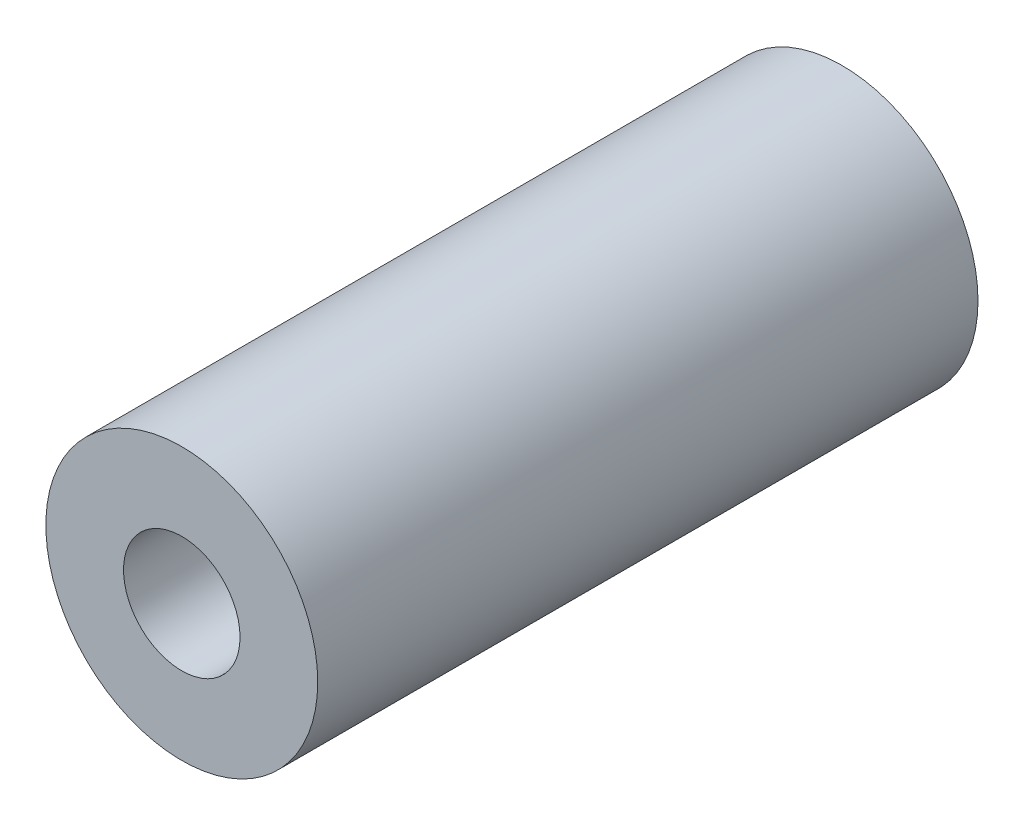
ISO-10303-21;
HEADER;
FILE_DESCRIPTION(('STEP AP214'),'2;1');
FILE_NAME('part.step','',(''),(''),'','','');
FILE_SCHEMA(('AUTOMOTIVE_DESIGN { 1 0 10303 214 1 1 1 1 }'));
ENDSEC;
DATA;
#1=APPLICATION_CONTEXT('core data for automotive mechanical design processes');
#2=APPLICATION_PROTOCOL_DEFINITION('international standard','automotive_design',2000,#1);
#3=PRODUCT_CONTEXT('',#1,'mechanical');
#4=PRODUCT('Part','Part','',(#3));
#5=PRODUCT_RELATED_PRODUCT_CATEGORY('part','',(#4));
#6=PRODUCT_DEFINITION_FORMATION('','',#4);
#7=PRODUCT_DEFINITION_CONTEXT('part definition',#1,'design');
#8=PRODUCT_DEFINITION('design','',#6,#7);
#9=PRODUCT_DEFINITION_SHAPE('','',#8);
#10=(LENGTH_UNIT() NAMED_UNIT(*) SI_UNIT(.MILLI.,.METRE.));
#11=(NAMED_UNIT(*) PLANE_ANGLE_UNIT() SI_UNIT($,.RADIAN.));
#12=(NAMED_UNIT(*) SI_UNIT($,.STERADIAN.) SOLID_ANGLE_UNIT());
#13=UNCERTAINTY_MEASURE_WITH_UNIT(LENGTH_MEASURE(1.E-05),#10,'distance_accuracy_value','');
#14=(GEOMETRIC_REPRESENTATION_CONTEXT(3) GLOBAL_UNCERTAINTY_ASSIGNED_CONTEXT((#13)) GLOBAL_UNIT_ASSIGNED_CONTEXT((#10,
#11,#12)) REPRESENTATION_CONTEXT('',''));
#15=CARTESIAN_POINT('',(0.,0.,0.));
#16=DIRECTION('',(0.,0.,1.));
#17=DIRECTION('',(1.,0.,0.));
#18=AXIS2_PLACEMENT_3D('',#15,#16,#17);
#19=CARTESIAN_POINT('',(0.,0.,17.));
#20=DIRECTION('',(0.,0.,1.));
#21=DIRECTION('',(1.,0.,0.));
#22=AXIS2_PLACEMENT_3D('',#19,#20,#21);
#23=PLANE('',#22);
#24=CARTESIAN_POINT('',(0.,0.,17.));
#25=DIRECTION('',(0.,0.,1.));
#26=DIRECTION('',(1.,0.,0.));
#27=AXIS2_PLACEMENT_3D('',#24,#25,#26);
#28=CIRCLE('',#27,3.5);
#29=CARTESIAN_POINT('',(3.5,0.,17.));
#30=VERTEX_POINT('',#29);
#31=EDGE_CURVE('E10',#30,#30,#28,.T.);
#32=ORIENTED_EDGE('',*,*,#31,.T.);
#33=EDGE_LOOP('',(#32));
#34=FACE_BOUND('',#33,.T.);
#35=CARTESIAN_POINT('',(0.,0.,17.));
#36=DIRECTION('',(0.,0.,1.));
#37=DIRECTION('',(1.,0.,0.));
#38=AXIS2_PLACEMENT_3D('',#35,#36,#37);
#39=CIRCLE('',#38,1.5);
#40=CARTESIAN_POINT('',(1.5,0.,17.));
#41=VERTEX_POINT('',#40);
#42=EDGE_CURVE('E43',#41,#41,#39,.T.);
#43=ORIENTED_EDGE('',*,*,#42,.F.);
#44=EDGE_LOOP('',(#43));
#45=FACE_BOUND('',#44,.T.);
#46=ADVANCED_FACE('F32',(#34,#45),#23,.T.);
#47=CARTESIAN_POINT('',(0.,0.,0.));
#48=DIRECTION('',(0.,0.,1.));
#49=DIRECTION('',(1.,0.,0.));
#50=AXIS2_PLACEMENT_3D('',#47,#48,#49);
#51=PLANE('',#50);
#52=CARTESIAN_POINT('',(0.,0.,0.));
#53=DIRECTION('',(0.,0.,1.));
#54=DIRECTION('',(1.,0.,0.));
#55=AXIS2_PLACEMENT_3D('',#52,#53,#54);
#56=CIRCLE('',#55,3.5);
#57=CARTESIAN_POINT('',(3.5,0.,0.));
#58=VERTEX_POINT('',#57);
#59=EDGE_CURVE('E36',#58,#58,#56,.T.);
#60=ORIENTED_EDGE('',*,*,#59,.F.);
#61=EDGE_LOOP('',(#60));
#62=FACE_BOUND('',#61,.T.);
#63=CARTESIAN_POINT('',(0.,0.,0.));
#64=DIRECTION('',(0.,0.,1.));
#65=DIRECTION('',(1.,0.,0.));
#66=AXIS2_PLACEMENT_3D('',#63,#64,#65);
#67=CIRCLE('',#66,1.5);
#68=CARTESIAN_POINT('',(1.5,0.,0.));
#69=VERTEX_POINT('',#68);
#70=EDGE_CURVE('E45',#69,#69,#67,.T.);
#71=ORIENTED_EDGE('',*,*,#70,.T.);
#72=EDGE_LOOP('',(#71));
#73=FACE_BOUND('',#72,.T.);
#74=ADVANCED_FACE('F55',(#62,#73),#51,.F.);
#75=CARTESIAN_POINT('',(0.,0.,17.));
#76=DIRECTION('',(0.,0.,-1.));
#77=DIRECTION('',(-1.,0.,0.));
#78=AXIS2_PLACEMENT_3D('',#75,#76,#77);
#79=CYLINDRICAL_SURFACE('',#78,3.5);
#80=ORIENTED_EDGE('',*,*,#31,.F.);
#81=EDGE_LOOP('',(#80));
#82=FACE_BOUND('',#81,.T.);
#83=ORIENTED_EDGE('',*,*,#59,.T.);
#84=EDGE_LOOP('',(#83));
#85=FACE_BOUND('',#84,.T.);
#86=ADVANCED_FACE('F34',(#82,#85),#79,.T.);
#87=CARTESIAN_POINT('',(0.,0.,17.));
#88=DIRECTION('',(0.,0.,-1.));
#89=DIRECTION('',(-1.,0.,0.));
#90=AXIS2_PLACEMENT_3D('',#87,#88,#89);
#91=CYLINDRICAL_SURFACE('',#90,1.5);
#92=ORIENTED_EDGE('',*,*,#42,.T.);
#93=EDGE_LOOP('',(#92));
#94=FACE_BOUND('',#93,.T.);
#95=ORIENTED_EDGE('',*,*,#70,.F.);
#96=EDGE_LOOP('',(#95));
#97=FACE_BOUND('',#96,.T.);
#98=ADVANCED_FACE('F51',(#94,#97),#91,.F.);
#99=CLOSED_SHELL('',(#46,#74,#86,#98));
#100=MANIFOLD_SOLID_BREP('B2',#99);
#101=ADVANCED_BREP_SHAPE_REPRESENTATION('',(#18,#100),#14);
#102=SHAPE_DEFINITION_REPRESENTATION(#9,#101);
ENDSEC;
END-ISO-10303-21;
